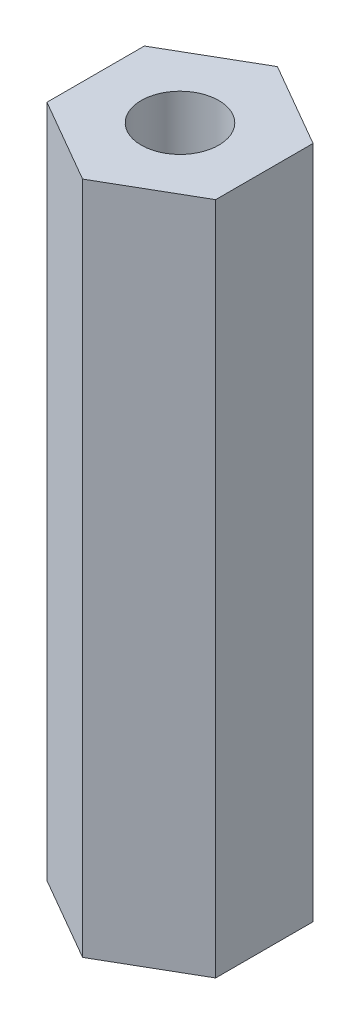
ISO-10303-21;
HEADER;
FILE_DESCRIPTION(('STEP AP214'),'2;1');
FILE_NAME('part.step','',(''),(''),'','','');
FILE_SCHEMA(('AUTOMOTIVE_DESIGN { 1 0 10303 214 1 1 1 1 }'));
ENDSEC;
DATA;
#1=APPLICATION_CONTEXT('core data for automotive mechanical design processes');
#2=APPLICATION_PROTOCOL_DEFINITION('international standard','automotive_design',2000,#1);
#3=PRODUCT_CONTEXT('',#1,'mechanical');
#4=PRODUCT('Part','Part','',(#3));
#5=PRODUCT_RELATED_PRODUCT_CATEGORY('part','',(#4));
#6=PRODUCT_DEFINITION_FORMATION('','',#4);
#7=PRODUCT_DEFINITION_CONTEXT('part definition',#1,'design');
#8=PRODUCT_DEFINITION('design','',#6,#7);
#9=PRODUCT_DEFINITION_SHAPE('','',#8);
#10=(LENGTH_UNIT() NAMED_UNIT(*) SI_UNIT(.MILLI.,.METRE.));
#11=(NAMED_UNIT(*) PLANE_ANGLE_UNIT() SI_UNIT($,.RADIAN.));
#12=(NAMED_UNIT(*) SI_UNIT($,.STERADIAN.) SOLID_ANGLE_UNIT());
#13=UNCERTAINTY_MEASURE_WITH_UNIT(LENGTH_MEASURE(1.E-05),#10,'distance_accuracy_value','');
#14=(GEOMETRIC_REPRESENTATION_CONTEXT(3) GLOBAL_UNCERTAINTY_ASSIGNED_CONTEXT((#13)) GLOBAL_UNIT_ASSIGNED_CONTEXT((#10,
#11,#12)) REPRESENTATION_CONTEXT('',''));
#15=CARTESIAN_POINT('',(0.,0.,0.));
#16=DIRECTION('',(0.,0.,1.));
#17=DIRECTION('',(1.,0.,0.));
#18=AXIS2_PLACEMENT_3D('',#15,#16,#17);
#19=CARTESIAN_POINT('',(0.,25.4,0.));
#20=DIRECTION('',(0.,-1.,0.));
#21=DIRECTION('',(0.,0.,-1.));
#22=AXIS2_PLACEMENT_3D('',#19,#20,#21);
#23=PLANE('',#22);
#24=DIRECTION('',(0.,0.,-1.));
#25=VECTOR('',#24,1.);
#26=CARTESIAN_POINT('',(3.17857303951003,25.4,-1.83514999999999));
#27=LINE('',#26,#25);
#28=CARTESIAN_POINT('',(3.17857303951002,25.4,1.83515000000002));
#29=VERTEX_POINT('',#28);
#30=CARTESIAN_POINT('',(3.17857303951003,25.4,-1.83514999999999));
#31=VERTEX_POINT('',#30);
#32=EDGE_CURVE('E129',#29,#31,#27,.T.);
#33=ORIENTED_EDGE('',*,*,#32,.T.);
#34=DIRECTION('',(-0.866025403784438,0.,-0.500000000000001));
#35=VECTOR('',#34,1.);
#36=CARTESIAN_POINT('',(0.,25.4,-3.6703));
#37=LINE('',#36,#35);
#38=CARTESIAN_POINT('',(0.,25.4,-3.6703));
#39=VERTEX_POINT('',#38);
#40=EDGE_CURVE('E87',#31,#39,#37,.T.);
#41=ORIENTED_EDGE('',*,*,#40,.T.);
#42=DIRECTION('',(-0.866025403784441,0.,0.499999999999995));
#43=VECTOR('',#42,1.);
#44=CARTESIAN_POINT('',(-3.17857303951,25.4,-1.83515000000004));
#45=LINE('',#44,#43);
#46=CARTESIAN_POINT('',(-3.17857303951,25.4,-1.83515000000004));
#47=VERTEX_POINT('',#46);
#48=EDGE_CURVE('E100',#39,#47,#45,.T.);
#49=ORIENTED_EDGE('',*,*,#48,.T.);
#50=DIRECTION('',(0.,0.,1.));
#51=VECTOR('',#50,1.);
#52=CARTESIAN_POINT('',(-3.17857303951004,25.4,1.83514999999997));
#53=LINE('',#52,#51);
#54=CARTESIAN_POINT('',(-3.17857303951004,25.4,1.83514999999997));
#55=VERTEX_POINT('',#54);
#56=EDGE_CURVE('E94',#47,#55,#53,.T.);
#57=ORIENTED_EDGE('',*,*,#56,.T.);
#58=DIRECTION('',(0.866025403784434,0.,0.500000000000007));
#59=VECTOR('',#58,1.);
#60=CARTESIAN_POINT('',(0.,25.4,3.6703));
#61=LINE('',#60,#59);
#62=CARTESIAN_POINT('',(0.,25.4,3.6703));
#63=VERTEX_POINT('',#62);
#64=EDGE_CURVE('E98',#55,#63,#61,.T.);
#65=ORIENTED_EDGE('',*,*,#64,.T.);
#66=DIRECTION('',(0.866025403784442,0.,-0.499999999999995));
#67=VECTOR('',#66,1.);
#68=CARTESIAN_POINT('',(3.17857303951002,25.4,1.83515000000002));
#69=LINE('',#68,#67);
#70=EDGE_CURVE('E50',#63,#29,#69,.T.);
#71=ORIENTED_EDGE('',*,*,#70,.T.);
#72=EDGE_LOOP('',(#33,#41,#49,#57,#65,#71));
#73=FACE_BOUND('',#72,.T.);
#74=CARTESIAN_POINT('',(0.,25.4,0.));
#75=DIRECTION('',(0.,1.,0.));
#76=DIRECTION('',(0.,0.,1.));
#77=AXIS2_PLACEMENT_3D('',#74,#75,#76);
#78=CIRCLE('',#77,1.4605);
#79=CARTESIAN_POINT('',(0.,25.4,1.4605));
#80=VERTEX_POINT('',#79);
#81=EDGE_CURVE('E122',#80,#80,#78,.T.);
#82=ORIENTED_EDGE('',*,*,#81,.F.);
#83=EDGE_LOOP('',(#82));
#84=FACE_BOUND('',#83,.T.);
#85=ADVANCED_FACE('F33',(#73,#84),#23,.F.);
#86=CARTESIAN_POINT('',(0.,0.,0.));
#87=DIRECTION('',(0.,-1.,0.));
#88=DIRECTION('',(0.,0.,-1.));
#89=AXIS2_PLACEMENT_3D('',#86,#87,#88);
#90=PLANE('',#89);
#91=DIRECTION('',(0.,0.,-1.));
#92=VECTOR('',#91,1.);
#93=CARTESIAN_POINT('',(3.17857303951003,0.,-1.83514999999999));
#94=LINE('',#93,#92);
#95=CARTESIAN_POINT('',(3.17857303951002,0.,1.83515000000002));
#96=VERTEX_POINT('',#95);
#97=CARTESIAN_POINT('',(3.17857303951003,0.,-1.83514999999999));
#98=VERTEX_POINT('',#97);
#99=EDGE_CURVE('E118',#96,#98,#94,.T.);
#100=ORIENTED_EDGE('',*,*,#99,.F.);
#101=DIRECTION('',(0.866025403784442,0.,-0.499999999999995));
#102=VECTOR('',#101,1.);
#103=CARTESIAN_POINT('',(3.17857303951002,0.,1.83515000000002));
#104=LINE('',#103,#102);
#105=CARTESIAN_POINT('',(0.,0.,3.6703));
#106=VERTEX_POINT('',#105);
#107=EDGE_CURVE('E79',#106,#96,#104,.T.);
#108=ORIENTED_EDGE('',*,*,#107,.F.);
#109=DIRECTION('',(0.866025403784434,0.,0.500000000000007));
#110=VECTOR('',#109,1.);
#111=CARTESIAN_POINT('',(0.,0.,3.6703));
#112=LINE('',#111,#110);
#113=CARTESIAN_POINT('',(-3.17857303951004,0.,1.83514999999997));
#114=VERTEX_POINT('',#113);
#115=EDGE_CURVE('E73',#114,#106,#112,.T.);
#116=ORIENTED_EDGE('',*,*,#115,.F.);
#117=DIRECTION('',(0.,0.,1.));
#118=VECTOR('',#117,1.);
#119=CARTESIAN_POINT('',(-3.17857303951004,0.,1.83514999999997));
#120=LINE('',#119,#118);
#121=CARTESIAN_POINT('',(-3.17857303951,0.,-1.83515000000004));
#122=VERTEX_POINT('',#121);
#123=EDGE_CURVE('E108',#122,#114,#120,.T.);
#124=ORIENTED_EDGE('',*,*,#123,.F.);
#125=DIRECTION('',(-0.866025403784441,0.,0.499999999999995));
#126=VECTOR('',#125,1.);
#127=CARTESIAN_POINT('',(-3.17857303951,0.,-1.83515000000004));
#128=LINE('',#127,#126);
#129=CARTESIAN_POINT('',(0.,0.,-3.6703));
#130=VERTEX_POINT('',#129);
#131=EDGE_CURVE('E124',#130,#122,#128,.T.);
#132=ORIENTED_EDGE('',*,*,#131,.F.);
#133=DIRECTION('',(-0.866025403784438,0.,-0.500000000000001));
#134=VECTOR('',#133,1.);
#135=CARTESIAN_POINT('',(0.,0.,-3.6703));
#136=LINE('',#135,#134);
#137=EDGE_CURVE('E121',#98,#130,#136,.T.);
#138=ORIENTED_EDGE('',*,*,#137,.F.);
#139=EDGE_LOOP('',(#100,#108,#116,#124,#132,#138));
#140=FACE_BOUND('',#139,.T.);
#141=CARTESIAN_POINT('',(0.,0.,0.));
#142=DIRECTION('',(0.,1.,0.));
#143=DIRECTION('',(0.,0.,1.));
#144=AXIS2_PLACEMENT_3D('',#141,#142,#143);
#145=CIRCLE('',#144,1.4605);
#146=CARTESIAN_POINT('',(0.,0.,1.4605));
#147=VERTEX_POINT('',#146);
#148=EDGE_CURVE('E222',#147,#147,#145,.T.);
#149=ORIENTED_EDGE('',*,*,#148,.T.);
#150=EDGE_LOOP('',(#149));
#151=FACE_BOUND('',#150,.T.);
#152=ADVANCED_FACE('F138',(#140,#151),#90,.T.);
#153=CARTESIAN_POINT('',(3.17857303951003,25.4,-1.83514999999999));
#154=DIRECTION('',(-1.,0.,0.));
#155=DIRECTION('',(0.,0.,1.));
#156=AXIS2_PLACEMENT_3D('',#153,#154,#155);
#157=PLANE('',#156);
#158=ORIENTED_EDGE('',*,*,#99,.T.);
#159=DIRECTION('',(0.,-1.,0.));
#160=VECTOR('',#159,1.);
#161=CARTESIAN_POINT('',(3.17857303951003,25.4,-1.83514999999999));
#162=LINE('',#161,#160);
#163=EDGE_CURVE('E11',#31,#98,#162,.T.);
#164=ORIENTED_EDGE('',*,*,#163,.F.);
#165=ORIENTED_EDGE('',*,*,#32,.F.);
#166=DIRECTION('',(0.,-1.,0.));
#167=VECTOR('',#166,1.);
#168=CARTESIAN_POINT('',(3.17857303951002,25.4,1.83515000000002));
#169=LINE('',#168,#167);
#170=EDGE_CURVE('E114',#29,#96,#169,.T.);
#171=ORIENTED_EDGE('',*,*,#170,.T.);
#172=EDGE_LOOP('',(#158,#164,#165,#171));
#173=FACE_BOUND('',#172,.T.);
#174=ADVANCED_FACE('F35',(#173),#157,.F.);
#175=CARTESIAN_POINT('',(0.,25.4,-3.6703));
#176=DIRECTION('',(-0.500000000000001,0.,0.866025403784438));
#177=DIRECTION('',(0.866025403784438,0.,0.500000000000001));
#178=AXIS2_PLACEMENT_3D('',#175,#176,#177);
#179=PLANE('',#178);
#180=ORIENTED_EDGE('',*,*,#137,.T.);
#181=DIRECTION('',(0.,-1.,0.));
#182=VECTOR('',#181,1.);
#183=CARTESIAN_POINT('',(0.,25.4,-3.6703));
#184=LINE('',#183,#182);
#185=EDGE_CURVE('E42',#39,#130,#184,.T.);
#186=ORIENTED_EDGE('',*,*,#185,.F.);
#187=ORIENTED_EDGE('',*,*,#40,.F.);
#188=ORIENTED_EDGE('',*,*,#163,.T.);
#189=EDGE_LOOP('',(#180,#186,#187,#188));
#190=FACE_BOUND('',#189,.T.);
#191=ADVANCED_FACE('F163',(#190),#179,.F.);
#192=CARTESIAN_POINT('',(-3.17857303951,25.4,-1.83515000000004));
#193=DIRECTION('',(0.499999999999995,0.,0.866025403784441));
#194=DIRECTION('',(0.866025403784442,0.,-0.499999999999995));
#195=AXIS2_PLACEMENT_3D('',#192,#193,#194);
#196=PLANE('',#195);
#197=ORIENTED_EDGE('',*,*,#131,.T.);
#198=DIRECTION('',(0.,-1.,0.));
#199=VECTOR('',#198,1.);
#200=CARTESIAN_POINT('',(-3.17857303951,25.4,-1.83515000000004));
#201=LINE('',#200,#199);
#202=EDGE_CURVE('E109',#47,#122,#201,.T.);
#203=ORIENTED_EDGE('',*,*,#202,.F.);
#204=ORIENTED_EDGE('',*,*,#48,.F.);
#205=ORIENTED_EDGE('',*,*,#185,.T.);
#206=EDGE_LOOP('',(#197,#203,#204,#205));
#207=FACE_BOUND('',#206,.T.);
#208=ADVANCED_FACE('F135',(#207),#196,.F.);
#209=CARTESIAN_POINT('',(-3.17857303951004,25.4,1.83514999999997));
#210=DIRECTION('',(1.,0.,0.));
#211=DIRECTION('',(0.,0.,-1.));
#212=AXIS2_PLACEMENT_3D('',#209,#210,#211);
#213=PLANE('',#212);
#214=ORIENTED_EDGE('',*,*,#123,.T.);
#215=DIRECTION('',(0.,-1.,0.));
#216=VECTOR('',#215,1.);
#217=CARTESIAN_POINT('',(-3.17857303951004,25.4,1.83514999999997));
#218=LINE('',#217,#216);
#219=EDGE_CURVE('E105',#55,#114,#218,.T.);
#220=ORIENTED_EDGE('',*,*,#219,.F.);
#221=ORIENTED_EDGE('',*,*,#56,.F.);
#222=ORIENTED_EDGE('',*,*,#202,.T.);
#223=EDGE_LOOP('',(#214,#220,#221,#222));
#224=FACE_BOUND('',#223,.T.);
#225=ADVANCED_FACE('F106',(#224),#213,.F.);
#226=CARTESIAN_POINT('',(0.,25.4,3.6703));
#227=DIRECTION('',(0.500000000000007,0.,-0.866025403784434));
#228=DIRECTION('',(-0.866025403784434,0.,-0.500000000000007));
#229=AXIS2_PLACEMENT_3D('',#226,#227,#228);
#230=PLANE('',#229);
#231=ORIENTED_EDGE('',*,*,#115,.T.);
#232=DIRECTION('',(0.,-1.,0.));
#233=VECTOR('',#232,1.);
#234=CARTESIAN_POINT('',(0.,25.4,3.6703));
#235=LINE('',#234,#233);
#236=EDGE_CURVE('E110',#63,#106,#235,.T.);
#237=ORIENTED_EDGE('',*,*,#236,.F.);
#238=ORIENTED_EDGE('',*,*,#64,.F.);
#239=ORIENTED_EDGE('',*,*,#219,.T.);
#240=EDGE_LOOP('',(#231,#237,#238,#239));
#241=FACE_BOUND('',#240,.T.);
#242=ADVANCED_FACE('F112',(#241),#230,.F.);
#243=CARTESIAN_POINT('',(3.17857303951002,25.4,1.83515000000002));
#244=DIRECTION('',(-0.499999999999995,0.,-0.866025403784442));
#245=DIRECTION('',(-0.866025403784442,0.,0.499999999999995));
#246=AXIS2_PLACEMENT_3D('',#243,#244,#245);
#247=PLANE('',#246);
#248=ORIENTED_EDGE('',*,*,#107,.T.);
#249=ORIENTED_EDGE('',*,*,#170,.F.);
#250=ORIENTED_EDGE('',*,*,#70,.F.);
#251=ORIENTED_EDGE('',*,*,#236,.T.);
#252=EDGE_LOOP('',(#248,#249,#250,#251));
#253=FACE_BOUND('',#252,.T.);
#254=ADVANCED_FACE('F143',(#253),#247,.F.);
#255=CARTESIAN_POINT('',(0.,25.4,0.));
#256=DIRECTION('',(0.,-1.,0.));
#257=DIRECTION('',(0.,0.,-1.));
#258=AXIS2_PLACEMENT_3D('',#255,#256,#257);
#259=CYLINDRICAL_SURFACE('',#258,1.4605);
#260=ORIENTED_EDGE('',*,*,#81,.T.);
#261=EDGE_LOOP('',(#260));
#262=FACE_BOUND('',#261,.T.);
#263=ORIENTED_EDGE('',*,*,#148,.F.);
#264=EDGE_LOOP('',(#263));
#265=FACE_BOUND('',#264,.T.);
#266=ADVANCED_FACE('F145',(#262,#265),#259,.F.);
#267=CLOSED_SHELL('',(#85,#152,#174,#191,#208,#225,#242,#254,#266));
#268=MANIFOLD_SOLID_BREP('B2',#267);
#269=ADVANCED_BREP_SHAPE_REPRESENTATION('',(#18,#268),#14);
#270=SHAPE_DEFINITION_REPRESENTATION(#9,#269);
ENDSEC;
END-ISO-10303-21;
